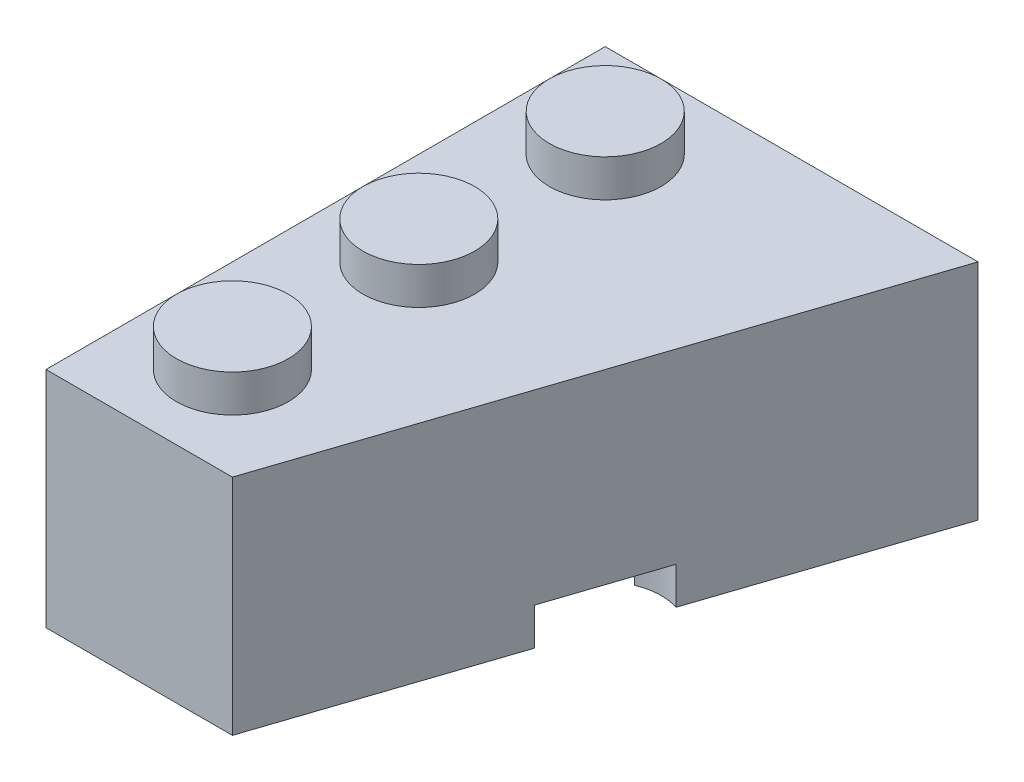
ISO-10303-21;
HEADER;
FILE_DESCRIPTION(('STEP AP214'),'2;1');
FILE_NAME('part.step','',(''),(''),'','','');
FILE_SCHEMA(('AUTOMOTIVE_DESIGN { 1 0 10303 214 1 1 1 1 }'));
ENDSEC;
DATA;
#1=APPLICATION_CONTEXT('core data for automotive mechanical design processes');
#2=APPLICATION_PROTOCOL_DEFINITION('international standard','automotive_design',2000,#1);
#3=PRODUCT_CONTEXT('',#1,'mechanical');
#4=PRODUCT('Part','Part','',(#3));
#5=PRODUCT_RELATED_PRODUCT_CATEGORY('part','',(#4));
#6=PRODUCT_DEFINITION_FORMATION('','',#4);
#7=PRODUCT_DEFINITION_CONTEXT('part definition',#1,'design');
#8=PRODUCT_DEFINITION('design','',#6,#7);
#9=PRODUCT_DEFINITION_SHAPE('','',#8);
#10=(LENGTH_UNIT() NAMED_UNIT(*) SI_UNIT(.MILLI.,.METRE.));
#11=(NAMED_UNIT(*) PLANE_ANGLE_UNIT() SI_UNIT($,.RADIAN.));
#12=(NAMED_UNIT(*) SI_UNIT($,.STERADIAN.) SOLID_ANGLE_UNIT());
#13=UNCERTAINTY_MEASURE_WITH_UNIT(LENGTH_MEASURE(1.E-05),#10,'distance_accuracy_value','');
#14=(GEOMETRIC_REPRESENTATION_CONTEXT(3) GLOBAL_UNCERTAINTY_ASSIGNED_CONTEXT((#13)) GLOBAL_UNIT_ASSIGNED_CONTEXT((#10,
#11,#12)) REPRESENTATION_CONTEXT('',''));
#15=CARTESIAN_POINT('',(0.,0.,0.));
#16=DIRECTION('',(0.,0.,1.));
#17=DIRECTION('',(1.,0.,0.));
#18=AXIS2_PLACEMENT_3D('',#15,#16,#17);
#19=CARTESIAN_POINT('',(4.,11.2,-20.));
#20=DIRECTION('',(0.,1.,0.));
#21=DIRECTION('',(0.,0.,1.));
#22=AXIS2_PLACEMENT_3D('',#19,#20,#21);
#23=PLANE('',#22);
#24=CARTESIAN_POINT('',(4.,11.2,-20.));
#25=DIRECTION('',(0.,1.,0.));
#26=DIRECTION('',(0.,0.,1.));
#27=AXIS2_PLACEMENT_3D('',#24,#25,#26);
#28=CIRCLE('',#27,2.4);
#29=CARTESIAN_POINT('',(4.,11.2,-17.6));
#30=VERTEX_POINT('',#29);
#31=EDGE_CURVE('E239',#30,#30,#28,.T.);
#32=ORIENTED_EDGE('',*,*,#31,.T.);
#33=EDGE_LOOP('',(#32));
#34=FACE_BOUND('',#33,.T.);
#35=ADVANCED_FACE('F38',(#34),#23,.T.);
#36=CARTESIAN_POINT('',(4.,11.2,-20.));
#37=DIRECTION('',(0.,-1.,0.));
#38=DIRECTION('',(0.,0.,-1.));
#39=AXIS2_PLACEMENT_3D('',#36,#37,#38);
#40=CYLINDRICAL_SURFACE('',#39,2.4);
#41=ORIENTED_EDGE('',*,*,#31,.F.);
#42=EDGE_LOOP('',(#41));
#43=FACE_BOUND('',#42,.T.);
#44=CARTESIAN_POINT('',(4.,9.6,-20.));
#45=DIRECTION('',(0.,1.,0.));
#46=DIRECTION('',(0.,0.,1.));
#47=AXIS2_PLACEMENT_3D('',#44,#45,#46);
#48=CIRCLE('',#47,2.4);
#49=CARTESIAN_POINT('',(4.,9.6,-17.6));
#50=VERTEX_POINT('',#49);
#51=EDGE_CURVE('E244',#50,#50,#48,.T.);
#52=ORIENTED_EDGE('',*,*,#51,.T.);
#53=EDGE_LOOP('',(#52));
#54=FACE_BOUND('',#53,.T.);
#55=ADVANCED_FACE('F304',(#43,#54),#40,.T.);
#56=CARTESIAN_POINT('',(0.,9.6,-24.));
#57=DIRECTION('',(1.,0.,0.));
#58=DIRECTION('',(0.,0.,-1.));
#59=AXIS2_PLACEMENT_3D('',#56,#57,#58);
#60=PLANE('',#59);
#61=DIRECTION('',(0.,0.,1.));
#62=VECTOR('',#61,1.);
#63=CARTESIAN_POINT('',(0.,0.,-24.));
#64=LINE('',#63,#62);
#65=CARTESIAN_POINT('',(0.,0.,-24.));
#66=VERTEX_POINT('',#65);
#67=CARTESIAN_POINT('',(0.,0.,0.));
#68=VERTEX_POINT('',#67);
#69=EDGE_CURVE('E268',#66,#68,#64,.T.);
#70=ORIENTED_EDGE('',*,*,#69,.T.);
#71=DIRECTION('',(0.,-1.,0.));
#72=VECTOR('',#71,1.);
#73=CARTESIAN_POINT('',(0.,9.6,0.));
#74=LINE('',#73,#72);
#75=CARTESIAN_POINT('',(0.,9.6,0.));
#76=VERTEX_POINT('',#75);
#77=EDGE_CURVE('E247',#76,#68,#74,.T.);
#78=ORIENTED_EDGE('',*,*,#77,.F.);
#79=DIRECTION('',(0.,0.,1.));
#80=VECTOR('',#79,1.);
#81=CARTESIAN_POINT('',(0.,9.6,-24.));
#82=LINE('',#81,#80);
#83=CARTESIAN_POINT('',(0.,9.6,-24.));
#84=VERTEX_POINT('',#83);
#85=EDGE_CURVE('E262',#84,#76,#82,.T.);
#86=ORIENTED_EDGE('',*,*,#85,.F.);
#87=DIRECTION('',(0.,-1.,0.));
#88=VECTOR('',#87,1.);
#89=CARTESIAN_POINT('',(0.,9.6,-24.));
#90=LINE('',#89,#88);
#91=EDGE_CURVE('E256',#84,#66,#90,.T.);
#92=ORIENTED_EDGE('',*,*,#91,.T.);
#93=EDGE_LOOP('',(#70,#78,#86,#92));
#94=FACE_BOUND('',#93,.T.);
#95=ADVANCED_FACE('F306',(#94),#60,.F.);
#96=CARTESIAN_POINT('',(0.,9.6,0.));
#97=DIRECTION('',(0.,0.,-1.));
#98=DIRECTION('',(-1.,0.,0.));
#99=AXIS2_PLACEMENT_3D('',#96,#97,#98);
#100=PLANE('',#99);
#101=DIRECTION('',(1.,0.,0.));
#102=VECTOR('',#101,1.);
#103=CARTESIAN_POINT('',(0.,0.,0.));
#104=LINE('',#103,#102);
#105=CARTESIAN_POINT('',(8.,0.,0.));
#106=VERTEX_POINT('',#105);
#107=EDGE_CURVE('E266',#68,#106,#104,.T.);
#108=ORIENTED_EDGE('',*,*,#107,.T.);
#109=DIRECTION('',(0.,-1.,0.));
#110=VECTOR('',#109,1.);
#111=CARTESIAN_POINT('',(8.,9.6,0.));
#112=LINE('',#111,#110);
#113=CARTESIAN_POINT('',(8.,9.6,0.));
#114=VERTEX_POINT('',#113);
#115=EDGE_CURVE('E250',#114,#106,#112,.T.);
#116=ORIENTED_EDGE('',*,*,#115,.F.);
#117=DIRECTION('',(1.,0.,0.));
#118=VECTOR('',#117,1.);
#119=CARTESIAN_POINT('',(0.,9.6,0.));
#120=LINE('',#119,#118);
#121=EDGE_CURVE('E275',#76,#114,#120,.T.);
#122=ORIENTED_EDGE('',*,*,#121,.F.);
#123=ORIENTED_EDGE('',*,*,#77,.T.);
#124=EDGE_LOOP('',(#108,#116,#122,#123));
#125=FACE_BOUND('',#124,.T.);
#126=ADVANCED_FACE('F312',(#125),#100,.F.);
#127=CARTESIAN_POINT('',(8.,9.6,0.));
#128=DIRECTION('',(-0.948683298050514,0.,-0.316227766016838));
#129=DIRECTION('',(-0.316227766016838,0.,0.948683298050514));
#130=AXIS2_PLACEMENT_3D('',#127,#128,#129);
#131=PLANE('',#130);
#132=DIRECTION('',(-0.316227766016838,0.,0.948683298050514));
#133=VECTOR('',#132,1.);
#134=CARTESIAN_POINT('',(8.,1.6,0.));
#135=LINE('',#134,#133);
#136=CARTESIAN_POINT('',(12.7589466384404,1.6,-14.2768399153212));
#137=VERTEX_POINT('',#136);
#138=CARTESIAN_POINT('',(11.2410533615596,1.6,-9.72316008467877));
#139=VERTEX_POINT('',#138);
#140=EDGE_CURVE('E144',#137,#139,#135,.T.);
#141=ORIENTED_EDGE('',*,*,#140,.F.);
#142=DIRECTION('',(0.,-1.,0.));
#143=VECTOR('',#142,1.);
#144=CARTESIAN_POINT('',(12.7589466384404,1.6,-14.2768399153212));
#145=LINE('',#144,#143);
#146=CARTESIAN_POINT('',(12.7589466384404,0.,-14.2768399153212));
#147=VERTEX_POINT('',#146);
#148=EDGE_CURVE('E208',#137,#147,#145,.T.);
#149=ORIENTED_EDGE('',*,*,#148,.T.);
#150=DIRECTION('',(0.316227766016838,0.,-0.948683298050514));
#151=VECTOR('',#150,1.);
#152=CARTESIAN_POINT('',(8.,0.,0.));
#153=LINE('',#152,#151);
#154=CARTESIAN_POINT('',(16.,0.,-24.));
#155=VERTEX_POINT('',#154);
#156=EDGE_CURVE('E265',#147,#155,#153,.T.);
#157=ORIENTED_EDGE('',*,*,#156,.T.);
#158=DIRECTION('',(0.,-1.,0.));
#159=VECTOR('',#158,1.);
#160=CARTESIAN_POINT('',(16.,9.6,-24.));
#161=LINE('',#160,#159);
#162=CARTESIAN_POINT('',(16.,9.6,-24.));
#163=VERTEX_POINT('',#162);
#164=EDGE_CURVE('E253',#163,#155,#161,.T.);
#165=ORIENTED_EDGE('',*,*,#164,.F.);
#166=DIRECTION('',(0.316227766016838,0.,-0.948683298050514));
#167=VECTOR('',#166,1.);
#168=CARTESIAN_POINT('',(8.,9.6,0.));
#169=LINE('',#168,#167);
#170=EDGE_CURVE('E273',#114,#163,#169,.T.);
#171=ORIENTED_EDGE('',*,*,#170,.F.);
#172=ORIENTED_EDGE('',*,*,#115,.T.);
#173=CARTESIAN_POINT('',(11.2410533615596,0.,-9.72316008467877));
#174=VERTEX_POINT('',#173);
#175=EDGE_CURVE('E263',#106,#174,#153,.T.);
#176=ORIENTED_EDGE('',*,*,#175,.T.);
#177=DIRECTION('',(0.,-1.,0.));
#178=VECTOR('',#177,1.);
#179=CARTESIAN_POINT('',(11.2410533615596,1.6,-9.72316008467877));
#180=LINE('',#179,#178);
#181=EDGE_CURVE('E217',#174,#139,#180,.F.);
#182=ORIENTED_EDGE('',*,*,#181,.T.);
#183=EDGE_LOOP('',(#141,#149,#157,#165,#171,#172,#176,#182));
#184=FACE_BOUND('',#183,.T.);
#185=ADVANCED_FACE('F320',(#184),#131,.F.);
#186=CARTESIAN_POINT('',(16.,9.6,-24.));
#187=DIRECTION('',(0.,0.,1.));
#188=DIRECTION('',(1.,0.,0.));
#189=AXIS2_PLACEMENT_3D('',#186,#187,#188);
#190=PLANE('',#189);
#191=DIRECTION('',(-1.,0.,0.));
#192=VECTOR('',#191,1.);
#193=CARTESIAN_POINT('',(16.,0.,-24.));
#194=LINE('',#193,#192);
#195=EDGE_CURVE('E260',#155,#66,#194,.T.);
#196=ORIENTED_EDGE('',*,*,#195,.T.);
#197=ORIENTED_EDGE('',*,*,#91,.F.);
#198=DIRECTION('',(-1.,0.,0.));
#199=VECTOR('',#198,1.);
#200=CARTESIAN_POINT('',(16.,9.6,-24.));
#201=LINE('',#200,#199);
#202=EDGE_CURVE('E259',#163,#84,#201,.T.);
#203=ORIENTED_EDGE('',*,*,#202,.F.);
#204=ORIENTED_EDGE('',*,*,#164,.T.);
#205=EDGE_LOOP('',(#196,#197,#203,#204));
#206=FACE_BOUND('',#205,.T.);
#207=ADVANCED_FACE('F295',(#206),#190,.F.);
#208=CARTESIAN_POINT('',(0.,9.6,0.));
#209=DIRECTION('',(0.,1.,0.));
#210=DIRECTION('',(0.,0.,1.));
#211=AXIS2_PLACEMENT_3D('',#208,#209,#210);
#212=PLANE('',#211);
#213=CARTESIAN_POINT('',(4.,9.6,-12.));
#214=DIRECTION('',(0.,1.,0.));
#215=DIRECTION('',(0.,0.,1.));
#216=AXIS2_PLACEMENT_3D('',#213,#214,#215);
#217=CIRCLE('',#216,2.4);
#218=CARTESIAN_POINT('',(4.,9.6,-9.6));
#219=VERTEX_POINT('',#218);
#220=EDGE_CURVE('E214',#219,#219,#217,.T.);
#221=ORIENTED_EDGE('',*,*,#220,.F.);
#222=EDGE_LOOP('',(#221));
#223=FACE_BOUND('',#222,.T.);
#224=CARTESIAN_POINT('',(4.,9.6,-4.));
#225=DIRECTION('',(0.,1.,0.));
#226=DIRECTION('',(0.,0.,1.));
#227=AXIS2_PLACEMENT_3D('',#224,#225,#226);
#228=CIRCLE('',#227,2.4);
#229=CARTESIAN_POINT('',(4.,9.6,-1.6));
#230=VERTEX_POINT('',#229);
#231=EDGE_CURVE('E279',#230,#230,#228,.T.);
#232=ORIENTED_EDGE('',*,*,#231,.F.);
#233=EDGE_LOOP('',(#232));
#234=FACE_BOUND('',#233,.T.);
#235=ORIENTED_EDGE('',*,*,#85,.T.);
#236=ORIENTED_EDGE('',*,*,#121,.T.);
#237=ORIENTED_EDGE('',*,*,#170,.T.);
#238=ORIENTED_EDGE('',*,*,#202,.T.);
#239=EDGE_LOOP('',(#235,#236,#237,#238));
#240=FACE_BOUND('',#239,.T.);
#241=ORIENTED_EDGE('',*,*,#51,.F.);
#242=EDGE_LOOP('',(#241));
#243=FACE_BOUND('',#242,.T.);
#244=ADVANCED_FACE('F292',(#223,#234,#240,#243),#212,.T.);
#245=CARTESIAN_POINT('',(0.,0.,0.));
#246=DIRECTION('',(0.,1.,0.));
#247=DIRECTION('',(0.,0.,1.));
#248=AXIS2_PLACEMENT_3D('',#245,#246,#247);
#249=PLANE('',#248);
#250=ORIENTED_EDGE('',*,*,#156,.F.);
#251=CARTESIAN_POINT('',(12.,0.,-12.));
#252=DIRECTION('',(0.,-1.,0.));
#253=DIRECTION('',(0.,0.,-1.));
#254=AXIS2_PLACEMENT_3D('',#251,#252,#253);
#255=CIRCLE('',#254,2.4);
#256=CARTESIAN_POINT('',(11.0477921480684,0.,-14.2030207004747));
#257=VERTEX_POINT('',#256);
#258=EDGE_CURVE('E156',#257,#147,#255,.T.);
#259=ORIENTED_EDGE('',*,*,#258,.F.);
#260=DIRECTION('',(0.316227766016838,0.,-0.948683298050514));
#261=VECTOR('',#260,1.);
#262=CARTESIAN_POINT('',(6.48210672311918,0.,-0.505964425626941));
#263=LINE('',#262,#261);
#264=CARTESIAN_POINT('',(12.1824331699509,0.,-17.6069437661221));
#265=VERTEX_POINT('',#264);
#266=EDGE_CURVE('E155',#257,#265,#263,.T.);
#267=ORIENTED_EDGE('',*,*,#266,.T.);
#268=CARTESIAN_POINT('',(12.,0.,-20.));
#269=DIRECTION('',(0.,-1.,0.));
#270=DIRECTION('',(0.,0.,-1.));
#271=AXIS2_PLACEMENT_3D('',#268,#269,#270);
#272=CIRCLE('',#271,2.4);
#273=CARTESIAN_POINT('',(13.5817802762874,0.,-21.8049850851317));
#274=VERTEX_POINT('',#273);
#275=EDGE_CURVE('E139',#274,#265,#272,.T.);
#276=ORIENTED_EDGE('',*,*,#275,.F.);
#277=CARTESIAN_POINT('',(13.7801185812435,0.,-22.4));
#278=VERTEX_POINT('',#277);
#279=EDGE_CURVE('E151',#274,#278,#263,.T.);
#280=ORIENTED_EDGE('',*,*,#279,.T.);
#281=DIRECTION('',(-1.,0.,0.));
#282=VECTOR('',#281,1.);
#283=CARTESIAN_POINT('',(16.,0.,-22.4));
#284=LINE('',#283,#282);
#285=CARTESIAN_POINT('',(1.6,0.,-22.4));
#286=VERTEX_POINT('',#285);
#287=EDGE_CURVE('E171',#278,#286,#284,.T.);
#288=ORIENTED_EDGE('',*,*,#287,.T.);
#289=DIRECTION('',(0.,0.,1.));
#290=VECTOR('',#289,1.);
#291=CARTESIAN_POINT('',(1.6,0.,-24.));
#292=LINE('',#291,#290);
#293=CARTESIAN_POINT('',(1.6,0.,-1.6));
#294=VERTEX_POINT('',#293);
#295=EDGE_CURVE('E167',#286,#294,#292,.T.);
#296=ORIENTED_EDGE('',*,*,#295,.T.);
#297=DIRECTION('',(1.,0.,0.));
#298=VECTOR('',#297,1.);
#299=CARTESIAN_POINT('',(0.,0.,-1.6));
#300=LINE('',#299,#298);
#301=CARTESIAN_POINT('',(6.8467852479102,0.,-1.6));
#302=VERTEX_POINT('',#301);
#303=EDGE_CURVE('E163',#294,#302,#300,.T.);
#304=ORIENTED_EDGE('',*,*,#303,.T.);
#305=CARTESIAN_POINT('',(9.91642129816994,0.,-10.8089081507792));
#306=VERTEX_POINT('',#305);
#307=EDGE_CURVE('E165',#302,#306,#263,.T.);
#308=ORIENTED_EDGE('',*,*,#307,.T.);
#309=EDGE_CURVE('E226',#174,#306,#255,.T.);
#310=ORIENTED_EDGE('',*,*,#309,.F.);
#311=ORIENTED_EDGE('',*,*,#175,.F.);
#312=ORIENTED_EDGE('',*,*,#107,.F.);
#313=ORIENTED_EDGE('',*,*,#69,.F.);
#314=ORIENTED_EDGE('',*,*,#195,.F.);
#315=EDGE_LOOP('',(#250,#259,#267,#276,#280,#288,#296,#304,#308,#310,#311,#312,#313,#314));
#316=FACE_BOUND('',#315,.T.);
#317=ADVANCED_FACE('F150',(#316),#249,.F.);
#318=CARTESIAN_POINT('',(4.,11.2,-4.));
#319=DIRECTION('',(0.,-1.,0.));
#320=DIRECTION('',(0.,0.,-1.));
#321=AXIS2_PLACEMENT_3D('',#318,#319,#320);
#322=CYLINDRICAL_SURFACE('',#321,2.4);
#323=CARTESIAN_POINT('',(4.,11.2,-4.));
#324=DIRECTION('',(0.,1.,0.));
#325=DIRECTION('',(0.,0.,1.));
#326=AXIS2_PLACEMENT_3D('',#323,#324,#325);
#327=CIRCLE('',#326,2.4);
#328=CARTESIAN_POINT('',(4.,11.2,-1.6));
#329=VERTEX_POINT('',#328);
#330=EDGE_CURVE('E271',#329,#329,#327,.T.);
#331=ORIENTED_EDGE('',*,*,#330,.F.);
#332=EDGE_LOOP('',(#331));
#333=FACE_BOUND('',#332,.T.);
#334=ORIENTED_EDGE('',*,*,#231,.T.);
#335=EDGE_LOOP('',(#334));
#336=FACE_BOUND('',#335,.T.);
#337=ADVANCED_FACE('F329',(#333,#336),#322,.T.);
#338=CARTESIAN_POINT('',(4.,11.2,-4.));
#339=DIRECTION('',(0.,1.,0.));
#340=DIRECTION('',(0.,0.,1.));
#341=AXIS2_PLACEMENT_3D('',#338,#339,#340);
#342=PLANE('',#341);
#343=ORIENTED_EDGE('',*,*,#330,.T.);
#344=EDGE_LOOP('',(#343));
#345=FACE_BOUND('',#344,.T.);
#346=ADVANCED_FACE('F333',(#345),#342,.T.);
#347=CARTESIAN_POINT('',(4.,11.2,-12.));
#348=DIRECTION('',(0.,-1.,0.));
#349=DIRECTION('',(0.,0.,-1.));
#350=AXIS2_PLACEMENT_3D('',#347,#348,#349);
#351=CYLINDRICAL_SURFACE('',#350,2.4);
#352=CARTESIAN_POINT('',(4.,11.2,-12.));
#353=DIRECTION('',(0.,1.,0.));
#354=DIRECTION('',(0.,0.,1.));
#355=AXIS2_PLACEMENT_3D('',#352,#353,#354);
#356=CIRCLE('',#355,2.4);
#357=CARTESIAN_POINT('',(4.,11.2,-9.6));
#358=VERTEX_POINT('',#357);
#359=EDGE_CURVE('E282',#358,#358,#356,.T.);
#360=ORIENTED_EDGE('',*,*,#359,.F.);
#361=EDGE_LOOP('',(#360));
#362=FACE_BOUND('',#361,.T.);
#363=ORIENTED_EDGE('',*,*,#220,.T.);
#364=EDGE_LOOP('',(#363));
#365=FACE_BOUND('',#364,.T.);
#366=ADVANCED_FACE('F290',(#362,#365),#351,.T.);
#367=CARTESIAN_POINT('',(4.,11.2,-12.));
#368=DIRECTION('',(0.,1.,0.));
#369=DIRECTION('',(0.,0.,1.));
#370=AXIS2_PLACEMENT_3D('',#367,#368,#369);
#371=PLANE('',#370);
#372=ORIENTED_EDGE('',*,*,#359,.T.);
#373=EDGE_LOOP('',(#372));
#374=FACE_BOUND('',#373,.T.);
#375=ADVANCED_FACE('F340',(#374),#371,.T.);
#376=CARTESIAN_POINT('',(4.,9.6,-20.));
#377=DIRECTION('',(0.,1.,0.));
#378=DIRECTION('',(0.,0.,1.));
#379=AXIS2_PLACEMENT_3D('',#376,#377,#378);
#380=PLANE('',#379);
#381=CARTESIAN_POINT('',(4.,9.6,-20.));
#382=DIRECTION('',(0.,1.,0.));
#383=DIRECTION('',(0.,0.,1.));
#384=AXIS2_PLACEMENT_3D('',#381,#382,#383);
#385=CIRCLE('',#384,0.799999999999999);
#386=CARTESIAN_POINT('',(4.,9.6,-19.2));
#387=VERTEX_POINT('',#386);
#388=EDGE_CURVE('E211',#387,#387,#385,.T.);
#389=ORIENTED_EDGE('',*,*,#388,.F.);
#390=EDGE_LOOP('',(#389));
#391=FACE_BOUND('',#390,.T.);
#392=ADVANCED_FACE('F344',(#391),#380,.F.);
#393=CARTESIAN_POINT('',(4.,11.2,-20.));
#394=DIRECTION('',(0.,-1.,0.));
#395=DIRECTION('',(0.,0.,-1.));
#396=AXIS2_PLACEMENT_3D('',#393,#394,#395);
#397=CYLINDRICAL_SURFACE('',#396,0.799999999999999);
#398=ORIENTED_EDGE('',*,*,#388,.T.);
#399=EDGE_LOOP('',(#398));
#400=FACE_BOUND('',#399,.T.);
#401=CARTESIAN_POINT('',(4.,8.,-20.));
#402=DIRECTION('',(0.,1.,0.));
#403=DIRECTION('',(0.,0.,1.));
#404=AXIS2_PLACEMENT_3D('',#401,#402,#403);
#405=CIRCLE('',#404,0.799999999999999);
#406=CARTESIAN_POINT('',(4.,8.,-19.2));
#407=VERTEX_POINT('',#406);
#408=EDGE_CURVE('E199',#407,#407,#405,.T.);
#409=ORIENTED_EDGE('',*,*,#408,.F.);
#410=EDGE_LOOP('',(#409));
#411=FACE_BOUND('',#410,.T.);
#412=ADVANCED_FACE('F379',(#400,#411),#397,.F.);
#413=CARTESIAN_POINT('',(1.6,9.6,-24.));
#414=DIRECTION('',(1.,0.,0.));
#415=DIRECTION('',(0.,0.,-1.));
#416=AXIS2_PLACEMENT_3D('',#413,#414,#415);
#417=PLANE('',#416);
#418=ORIENTED_EDGE('',*,*,#295,.F.);
#419=DIRECTION('',(0.,-1.,0.));
#420=VECTOR('',#419,1.);
#421=CARTESIAN_POINT('',(1.6,9.6,-22.4));
#422=LINE('',#421,#420);
#423=CARTESIAN_POINT('',(1.6,8.,-22.4));
#424=VERTEX_POINT('',#423);
#425=EDGE_CURVE('E191',#424,#286,#422,.T.);
#426=ORIENTED_EDGE('',*,*,#425,.F.);
#427=DIRECTION('',(0.,0.,1.));
#428=VECTOR('',#427,1.);
#429=CARTESIAN_POINT('',(1.6,8.,-24.));
#430=LINE('',#429,#428);
#431=CARTESIAN_POINT('',(1.6,8.,-1.6));
#432=VERTEX_POINT('',#431);
#433=EDGE_CURVE('E173',#424,#432,#430,.T.);
#434=ORIENTED_EDGE('',*,*,#433,.T.);
#435=DIRECTION('',(0.,-1.,0.));
#436=VECTOR('',#435,1.);
#437=CARTESIAN_POINT('',(1.6,9.6,-1.6));
#438=LINE('',#437,#436);
#439=EDGE_CURVE('E194',#432,#294,#438,.T.);
#440=ORIENTED_EDGE('',*,*,#439,.T.);
#441=EDGE_LOOP('',(#418,#426,#434,#440));
#442=FACE_BOUND('',#441,.T.);
#443=ADVANCED_FACE('F375',(#442),#417,.T.);
#444=CARTESIAN_POINT('',(0.,9.6,-1.6));
#445=DIRECTION('',(0.,0.,-1.));
#446=DIRECTION('',(-1.,0.,0.));
#447=AXIS2_PLACEMENT_3D('',#444,#445,#446);
#448=PLANE('',#447);
#449=ORIENTED_EDGE('',*,*,#303,.F.);
#450=ORIENTED_EDGE('',*,*,#439,.F.);
#451=DIRECTION('',(1.,0.,0.));
#452=VECTOR('',#451,1.);
#453=CARTESIAN_POINT('',(0.,8.,-1.6));
#454=LINE('',#453,#452);
#455=CARTESIAN_POINT('',(6.8467852479102,8.,-1.6));
#456=VERTEX_POINT('',#455);
#457=EDGE_CURVE('E177',#432,#456,#454,.T.);
#458=ORIENTED_EDGE('',*,*,#457,.T.);
#459=DIRECTION('',(0.,-1.,0.));
#460=VECTOR('',#459,1.);
#461=CARTESIAN_POINT('',(6.8467852479102,9.6,-1.6));
#462=LINE('',#461,#460);
#463=EDGE_CURVE('E190',#456,#302,#462,.T.);
#464=ORIENTED_EDGE('',*,*,#463,.T.);
#465=EDGE_LOOP('',(#449,#450,#458,#464));
#466=FACE_BOUND('',#465,.T.);
#467=ADVANCED_FACE('F372',(#466),#448,.T.);
#468=CARTESIAN_POINT('',(6.48210672311918,9.6,-0.505964425626941));
#469=DIRECTION('',(-0.948683298050514,0.,-0.316227766016838));
#470=DIRECTION('',(-0.316227766016838,0.,0.948683298050514));
#471=AXIS2_PLACEMENT_3D('',#468,#469,#470);
#472=PLANE('',#471);
#473=DIRECTION('',(0.,-1.,0.));
#474=VECTOR('',#473,1.);
#475=CARTESIAN_POINT('',(11.0477921480684,1.6,-14.2030207004747));
#476=LINE('',#475,#474);
#477=CARTESIAN_POINT('',(11.0477921480684,1.6,-14.2030207004747));
#478=VERTEX_POINT('',#477);
#479=EDGE_CURVE('E11',#478,#257,#476,.T.);
#480=ORIENTED_EDGE('',*,*,#479,.F.);
#481=DIRECTION('',(-0.316227766016838,0.,0.948683298050514));
#482=VECTOR('',#481,1.);
#483=CARTESIAN_POINT('',(6.48210672311918,1.6,-0.505964425626941));
#484=LINE('',#483,#482);
#485=CARTESIAN_POINT('',(9.91642129816994,1.6,-10.8089081507792));
#486=VERTEX_POINT('',#485);
#487=EDGE_CURVE('E238',#478,#486,#484,.T.);
#488=ORIENTED_EDGE('',*,*,#487,.T.);
#489=DIRECTION('',(0.,-1.,0.));
#490=VECTOR('',#489,1.);
#491=CARTESIAN_POINT('',(9.91642129816994,1.6,-10.8089081507792));
#492=LINE('',#491,#490);
#493=EDGE_CURVE('E45',#306,#486,#492,.F.);
#494=ORIENTED_EDGE('',*,*,#493,.F.);
#495=ORIENTED_EDGE('',*,*,#307,.F.);
#496=ORIENTED_EDGE('',*,*,#463,.F.);
#497=DIRECTION('',(0.316227766016838,0.,-0.948683298050514));
#498=VECTOR('',#497,1.);
#499=CARTESIAN_POINT('',(6.48210672311918,8.,-0.505964425626941));
#500=LINE('',#499,#498);
#501=CARTESIAN_POINT('',(13.7801185812435,8.,-22.4));
#502=VERTEX_POINT('',#501);
#503=EDGE_CURVE('E201',#456,#502,#500,.T.);
#504=ORIENTED_EDGE('',*,*,#503,.T.);
#505=DIRECTION('',(0.,-1.,0.));
#506=VECTOR('',#505,1.);
#507=CARTESIAN_POINT('',(13.7801185812435,9.6,-22.4));
#508=LINE('',#507,#506);
#509=EDGE_CURVE('E161',#502,#278,#508,.T.);
#510=ORIENTED_EDGE('',*,*,#509,.T.);
#511=ORIENTED_EDGE('',*,*,#279,.F.);
#512=DIRECTION('',(0.,-1.,0.));
#513=VECTOR('',#512,1.);
#514=CARTESIAN_POINT('',(13.5817802762874,1.6,-21.8049850851317));
#515=LINE('',#514,#513);
#516=CARTESIAN_POINT('',(13.5817802762874,1.6,-21.8049850851317));
#517=VERTEX_POINT('',#516);
#518=EDGE_CURVE('E136',#517,#274,#515,.T.);
#519=ORIENTED_EDGE('',*,*,#518,.F.);
#520=DIRECTION('',(-0.316227766016838,0.,0.948683298050514));
#521=VECTOR('',#520,1.);
#522=CARTESIAN_POINT('',(6.48210672311918,1.6,-0.505964425626941));
#523=LINE('',#522,#521);
#524=CARTESIAN_POINT('',(12.1824331699509,1.6,-17.6069437661221));
#525=VERTEX_POINT('',#524);
#526=EDGE_CURVE('E222',#517,#525,#523,.T.);
#527=ORIENTED_EDGE('',*,*,#526,.T.);
#528=DIRECTION('',(0.,-1.,0.));
#529=VECTOR('',#528,1.);
#530=CARTESIAN_POINT('',(12.1824331699509,1.6,-17.6069437661221));
#531=LINE('',#530,#529);
#532=EDGE_CURVE('E145',#265,#525,#531,.F.);
#533=ORIENTED_EDGE('',*,*,#532,.F.);
#534=ORIENTED_EDGE('',*,*,#266,.F.);
#535=EDGE_LOOP('',(#480,#488,#494,#495,#496,#504,#510,#511,#519,#527,#533,#534));
#536=FACE_BOUND('',#535,.T.);
#537=ADVANCED_FACE('F159',(#536),#472,.T.);
#538=CARTESIAN_POINT('',(16.,9.6,-22.4));
#539=DIRECTION('',(0.,0.,1.));
#540=DIRECTION('',(1.,0.,0.));
#541=AXIS2_PLACEMENT_3D('',#538,#539,#540);
#542=PLANE('',#541);
#543=ORIENTED_EDGE('',*,*,#425,.T.);
#544=ORIENTED_EDGE('',*,*,#287,.F.);
#545=ORIENTED_EDGE('',*,*,#509,.F.);
#546=DIRECTION('',(-1.,0.,0.));
#547=VECTOR('',#546,1.);
#548=CARTESIAN_POINT('',(16.,8.,-22.4));
#549=LINE('',#548,#547);
#550=EDGE_CURVE('E196',#502,#424,#549,.T.);
#551=ORIENTED_EDGE('',*,*,#550,.T.);
#552=EDGE_LOOP('',(#543,#544,#545,#551));
#553=FACE_BOUND('',#552,.T.);
#554=ADVANCED_FACE('F365',(#553),#542,.T.);
#555=CARTESIAN_POINT('',(0.,8.,0.));
#556=DIRECTION('',(0.,1.,0.));
#557=DIRECTION('',(0.,0.,1.));
#558=AXIS2_PLACEMENT_3D('',#555,#556,#557);
#559=PLANE('',#558);
#560=CARTESIAN_POINT('',(4.,8.,-12.));
#561=DIRECTION('',(0.,1.,0.));
#562=DIRECTION('',(0.,0.,1.));
#563=AXIS2_PLACEMENT_3D('',#560,#561,#562);
#564=CIRCLE('',#563,0.799999999999999);
#565=CARTESIAN_POINT('',(4.,8.,-11.2));
#566=VERTEX_POINT('',#565);
#567=EDGE_CURVE('E186',#566,#566,#564,.T.);
#568=ORIENTED_EDGE('',*,*,#567,.T.);
#569=EDGE_LOOP('',(#568));
#570=FACE_BOUND('',#569,.T.);
#571=CARTESIAN_POINT('',(4.,8.,-4.));
#572=DIRECTION('',(0.,1.,0.));
#573=DIRECTION('',(0.,0.,1.));
#574=AXIS2_PLACEMENT_3D('',#571,#572,#573);
#575=CIRCLE('',#574,0.799999999999999);
#576=CARTESIAN_POINT('',(4.,8.,-3.2));
#577=VERTEX_POINT('',#576);
#578=EDGE_CURVE('E185',#577,#577,#575,.T.);
#579=ORIENTED_EDGE('',*,*,#578,.T.);
#580=EDGE_LOOP('',(#579));
#581=FACE_BOUND('',#580,.T.);
#582=ORIENTED_EDGE('',*,*,#433,.F.);
#583=ORIENTED_EDGE('',*,*,#550,.F.);
#584=ORIENTED_EDGE('',*,*,#503,.F.);
#585=ORIENTED_EDGE('',*,*,#457,.F.);
#586=EDGE_LOOP('',(#582,#583,#584,#585));
#587=FACE_BOUND('',#586,.T.);
#588=ORIENTED_EDGE('',*,*,#408,.T.);
#589=EDGE_LOOP('',(#588));
#590=FACE_BOUND('',#589,.T.);
#591=ADVANCED_FACE('F361',(#570,#581,#587,#590),#559,.F.);
#592=CARTESIAN_POINT('',(4.,11.2,-4.));
#593=DIRECTION('',(0.,-1.,0.));
#594=DIRECTION('',(0.,0.,-1.));
#595=AXIS2_PLACEMENT_3D('',#592,#593,#594);
#596=CYLINDRICAL_SURFACE('',#595,0.799999999999999);
#597=CARTESIAN_POINT('',(4.,9.6,-4.));
#598=DIRECTION('',(0.,1.,0.));
#599=DIRECTION('',(0.,0.,1.));
#600=AXIS2_PLACEMENT_3D('',#597,#598,#599);
#601=CIRCLE('',#600,0.799999999999999);
#602=CARTESIAN_POINT('',(4.,9.6,-3.2));
#603=VERTEX_POINT('',#602);
#604=EDGE_CURVE('E181',#603,#603,#601,.T.);
#605=ORIENTED_EDGE('',*,*,#604,.T.);
#606=EDGE_LOOP('',(#605));
#607=FACE_BOUND('',#606,.T.);
#608=ORIENTED_EDGE('',*,*,#578,.F.);
#609=EDGE_LOOP('',(#608));
#610=FACE_BOUND('',#609,.T.);
#611=ADVANCED_FACE('F357',(#607,#610),#596,.F.);
#612=CARTESIAN_POINT('',(4.,9.6,-4.));
#613=DIRECTION('',(0.,1.,0.));
#614=DIRECTION('',(0.,0.,1.));
#615=AXIS2_PLACEMENT_3D('',#612,#613,#614);
#616=PLANE('',#615);
#617=ORIENTED_EDGE('',*,*,#604,.F.);
#618=EDGE_LOOP('',(#617));
#619=FACE_BOUND('',#618,.T.);
#620=ADVANCED_FACE('F353',(#619),#616,.F.);
#621=CARTESIAN_POINT('',(4.,11.2,-12.));
#622=DIRECTION('',(0.,-1.,0.));
#623=DIRECTION('',(0.,0.,-1.));
#624=AXIS2_PLACEMENT_3D('',#621,#622,#623);
#625=CYLINDRICAL_SURFACE('',#624,0.799999999999999);
#626=CARTESIAN_POINT('',(4.,9.6,-12.));
#627=DIRECTION('',(0.,1.,0.));
#628=DIRECTION('',(0.,0.,1.));
#629=AXIS2_PLACEMENT_3D('',#626,#627,#628);
#630=CIRCLE('',#629,0.799999999999999);
#631=CARTESIAN_POINT('',(4.,9.6,-11.2));
#632=VERTEX_POINT('',#631);
#633=EDGE_CURVE('E182',#632,#632,#630,.T.);
#634=ORIENTED_EDGE('',*,*,#633,.T.);
#635=EDGE_LOOP('',(#634));
#636=FACE_BOUND('',#635,.T.);
#637=ORIENTED_EDGE('',*,*,#567,.F.);
#638=EDGE_LOOP('',(#637));
#639=FACE_BOUND('',#638,.T.);
#640=ADVANCED_FACE('F349',(#636,#639),#625,.F.);
#641=CARTESIAN_POINT('',(4.,9.6,-12.));
#642=DIRECTION('',(0.,1.,0.));
#643=DIRECTION('',(0.,0.,1.));
#644=AXIS2_PLACEMENT_3D('',#641,#642,#643);
#645=PLANE('',#644);
#646=ORIENTED_EDGE('',*,*,#633,.F.);
#647=EDGE_LOOP('',(#646));
#648=FACE_BOUND('',#647,.T.);
#649=ADVANCED_FACE('F346',(#648),#645,.F.);
#650=CARTESIAN_POINT('',(12.,1.6,-20.));
#651=DIRECTION('',(0.,-1.,0.));
#652=DIRECTION('',(0.,0.,-1.));
#653=AXIS2_PLACEMENT_3D('',#650,#651,#652);
#654=CYLINDRICAL_SURFACE('',#653,2.4);
#655=ORIENTED_EDGE('',*,*,#518,.T.);
#656=ORIENTED_EDGE('',*,*,#275,.T.);
#657=ORIENTED_EDGE('',*,*,#532,.T.);
#658=CARTESIAN_POINT('',(12.,1.6,-20.));
#659=DIRECTION('',(0.,-1.,0.));
#660=DIRECTION('',(0.,0.,-1.));
#661=AXIS2_PLACEMENT_3D('',#658,#659,#660);
#662=CIRCLE('',#661,2.4);
#663=EDGE_CURVE('E59',#517,#525,#662,.T.);
#664=ORIENTED_EDGE('',*,*,#663,.F.);
#665=EDGE_LOOP('',(#655,#656,#657,#664));
#666=FACE_BOUND('',#665,.T.);
#667=ADVANCED_FACE('F138',(#666),#654,.F.);
#668=CARTESIAN_POINT('',(12.,1.6,-20.));
#669=DIRECTION('',(0.,-1.,0.));
#670=DIRECTION('',(0.,0.,-1.));
#671=AXIS2_PLACEMENT_3D('',#668,#669,#670);
#672=PLANE('',#671);
#673=ORIENTED_EDGE('',*,*,#663,.T.);
#674=ORIENTED_EDGE('',*,*,#526,.F.);
#675=EDGE_LOOP('',(#673,#674));
#676=FACE_BOUND('',#675,.T.);
#677=ADVANCED_FACE('F387',(#676),#672,.T.);
#678=CARTESIAN_POINT('',(12.,1.6,-12.));
#679=DIRECTION('',(0.,-1.,0.));
#680=DIRECTION('',(0.,0.,-1.));
#681=AXIS2_PLACEMENT_3D('',#678,#679,#680);
#682=CYLINDRICAL_SURFACE('',#681,2.4);
#683=CARTESIAN_POINT('',(12.,1.6,-12.));
#684=DIRECTION('',(0.,-1.,0.));
#685=DIRECTION('',(0.,0.,-1.));
#686=AXIS2_PLACEMENT_3D('',#683,#684,#685);
#687=CIRCLE('',#686,2.4);
#688=EDGE_CURVE('E227',#478,#137,#687,.T.);
#689=ORIENTED_EDGE('',*,*,#688,.F.);
#690=ORIENTED_EDGE('',*,*,#479,.T.);
#691=ORIENTED_EDGE('',*,*,#258,.T.);
#692=ORIENTED_EDGE('',*,*,#148,.F.);
#693=EDGE_LOOP('',(#689,#690,#691,#692));
#694=FACE_BOUND('',#693,.T.);
#695=ADVANCED_FACE('F390',(#694),#682,.F.);
#696=ORIENTED_EDGE('',*,*,#309,.T.);
#697=ORIENTED_EDGE('',*,*,#493,.T.);
#698=EDGE_CURVE('E52',#139,#486,#687,.T.);
#699=ORIENTED_EDGE('',*,*,#698,.F.);
#700=ORIENTED_EDGE('',*,*,#181,.F.);
#701=EDGE_LOOP('',(#696,#697,#699,#700));
#702=FACE_BOUND('',#701,.T.);
#703=ADVANCED_FACE('F233',(#702),#682,.F.);
#704=CARTESIAN_POINT('',(12.,1.6,-12.));
#705=DIRECTION('',(0.,-1.,0.));
#706=DIRECTION('',(0.,0.,-1.));
#707=AXIS2_PLACEMENT_3D('',#704,#705,#706);
#708=PLANE('',#707);
#709=ORIENTED_EDGE('',*,*,#140,.T.);
#710=ORIENTED_EDGE('',*,*,#698,.T.);
#711=ORIENTED_EDGE('',*,*,#487,.F.);
#712=ORIENTED_EDGE('',*,*,#688,.T.);
#713=EDGE_LOOP('',(#709,#710,#711,#712));
#714=FACE_BOUND('',#713,.T.);
#715=ADVANCED_FACE('F396',(#714),#708,.T.);
#716=CLOSED_SHELL('',(#35,#55,#95,#126,#185,#207,#244,#317,#337,#346,#366,#375,#392,#412,#443,
#467,#537,#554,#591,#611,#620,#640,#649,#667,#677,#695,#703,#715));
#717=MANIFOLD_SOLID_BREP('B2',#716);
#718=ADVANCED_BREP_SHAPE_REPRESENTATION('',(#18,#717),#14);
#719=SHAPE_DEFINITION_REPRESENTATION(#9,#718);
ENDSEC;
END-ISO-10303-21;
